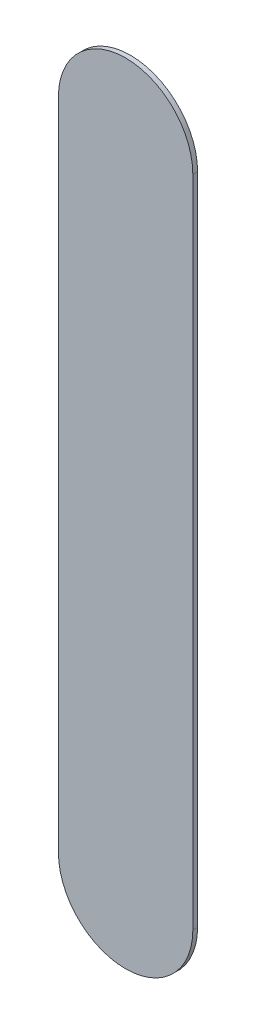
ISO-10303-21;
HEADER;
FILE_DESCRIPTION(('STEP AP214'),'2;1');
FILE_NAME('part.step','',(''),(''),'','','');
FILE_SCHEMA(('AUTOMOTIVE_DESIGN { 1 0 10303 214 1 1 1 1 }'));
ENDSEC;
DATA;
#1=APPLICATION_CONTEXT('core data for automotive mechanical design processes');
#2=APPLICATION_PROTOCOL_DEFINITION('international standard','automotive_design',2000,#1);
#3=PRODUCT_CONTEXT('',#1,'mechanical');
#4=PRODUCT('Part','Part','',(#3));
#5=PRODUCT_RELATED_PRODUCT_CATEGORY('part','',(#4));
#6=PRODUCT_DEFINITION_FORMATION('','',#4);
#7=PRODUCT_DEFINITION_CONTEXT('part definition',#1,'design');
#8=PRODUCT_DEFINITION('design','',#6,#7);
#9=PRODUCT_DEFINITION_SHAPE('','',#8);
#10=(LENGTH_UNIT() NAMED_UNIT(*) SI_UNIT(.MILLI.,.METRE.));
#11=(NAMED_UNIT(*) PLANE_ANGLE_UNIT() SI_UNIT($,.RADIAN.));
#12=(NAMED_UNIT(*) SI_UNIT($,.STERADIAN.) SOLID_ANGLE_UNIT());
#13=UNCERTAINTY_MEASURE_WITH_UNIT(LENGTH_MEASURE(1.E-05),#10,'distance_accuracy_value','');
#14=(GEOMETRIC_REPRESENTATION_CONTEXT(3) GLOBAL_UNCERTAINTY_ASSIGNED_CONTEXT((#13)) GLOBAL_UNIT_ASSIGNED_CONTEXT((#10,
#11,#12)) REPRESENTATION_CONTEXT('',''));
#15=CARTESIAN_POINT('',(0.,0.,0.));
#16=DIRECTION('',(0.,0.,1.));
#17=DIRECTION('',(1.,0.,0.));
#18=AXIS2_PLACEMENT_3D('',#15,#16,#17);
#19=CARTESIAN_POINT('',(76.979399,97.79,0.));
#20=DIRECTION('',(-1.,0.,0.));
#21=DIRECTION('',(0.,1.,0.));
#22=AXIS2_PLACEMENT_3D('',#19,#20,#21);
#23=PLANE('',#22);
#24=DIRECTION('',(0.,1.,0.));
#25=VECTOR('',#24,1.);
#26=CARTESIAN_POINT('',(76.979399,97.79,0.03556));
#27=LINE('',#26,#25);
#28=CARTESIAN_POINT('',(76.979399,97.79,0.03556));
#29=VERTEX_POINT('',#28);
#30=CARTESIAN_POINT('',(76.979399,102.6593832,0.03556));
#31=VERTEX_POINT('',#30);
#32=EDGE_CURVE('E11',#29,#31,#27,.T.);
#33=ORIENTED_EDGE('',*,*,#32,.F.);
#34=DIRECTION('',(0.,0.,1.));
#35=VECTOR('',#34,1.);
#36=CARTESIAN_POINT('',(76.979399,97.79,0.));
#37=LINE('',#36,#35);
#38=CARTESIAN_POINT('',(76.979399,97.79,0.));
#39=VERTEX_POINT('',#38);
#40=EDGE_CURVE('E24',#39,#29,#37,.T.);
#41=ORIENTED_EDGE('',*,*,#40,.F.);
#42=DIRECTION('',(0.,1.,0.));
#43=VECTOR('',#42,1.);
#44=CARTESIAN_POINT('',(76.979399,97.79,0.));
#45=LINE('',#44,#43);
#46=CARTESIAN_POINT('',(76.979399,102.6593832,0.));
#47=VERTEX_POINT('',#46);
#48=EDGE_CURVE('E75',#39,#47,#45,.T.);
#49=ORIENTED_EDGE('',*,*,#48,.T.);
#50=DIRECTION('',(0.,0.,1.));
#51=VECTOR('',#50,1.);
#52=CARTESIAN_POINT('',(76.979399,102.6593832,0.));
#53=LINE('',#52,#51);
#54=EDGE_CURVE('E37',#47,#31,#53,.T.);
#55=ORIENTED_EDGE('',*,*,#54,.T.);
#56=EDGE_LOOP('',(#33,#41,#49,#55));
#57=FACE_BOUND('',#56,.T.);
#58=ADVANCED_FACE('F17',(#57),#23,.F.);
#59=CARTESIAN_POINT('',(76.4794,102.6593832,0.));
#60=DIRECTION('',(0.,0.,-1.));
#61=DIRECTION('',(1.,0.,0.));
#62=AXIS2_PLACEMENT_3D('',#59,#60,#61);
#63=CYLINDRICAL_SURFACE('',#62,0.499999000000002);
#64=CARTESIAN_POINT('',(76.4794,102.6593832,0.03556));
#65=DIRECTION('',(0.,0.,1.));
#66=DIRECTION('',(1.,0.,0.));
#67=AXIS2_PLACEMENT_3D('',#64,#65,#66);
#68=CIRCLE('',#67,0.499999000000002);
#69=CARTESIAN_POINT('',(75.979401,102.6593832,0.03556));
#70=VERTEX_POINT('',#69);
#71=EDGE_CURVE('E83',#31,#70,#68,.T.);
#72=ORIENTED_EDGE('',*,*,#71,.F.);
#73=ORIENTED_EDGE('',*,*,#54,.F.);
#74=CARTESIAN_POINT('',(76.4794,102.6593832,0.));
#75=DIRECTION('',(0.,0.,1.));
#76=DIRECTION('',(1.,0.,0.));
#77=AXIS2_PLACEMENT_3D('',#74,#75,#76);
#78=CIRCLE('',#77,0.499999000000002);
#79=CARTESIAN_POINT('',(75.979401,102.6593832,0.));
#80=VERTEX_POINT('',#79);
#81=EDGE_CURVE('E81',#47,#80,#78,.T.);
#82=ORIENTED_EDGE('',*,*,#81,.T.);
#83=DIRECTION('',(0.,0.,1.));
#84=VECTOR('',#83,1.);
#85=CARTESIAN_POINT('',(75.979401,102.6593832,0.));
#86=LINE('',#85,#84);
#87=EDGE_CURVE('E67',#80,#70,#86,.T.);
#88=ORIENTED_EDGE('',*,*,#87,.T.);
#89=EDGE_LOOP('',(#72,#73,#82,#88));
#90=FACE_BOUND('',#89,.T.);
#91=ADVANCED_FACE('F89',(#90),#63,.T.);
#92=CARTESIAN_POINT('',(75.979401,102.6593832,0.));
#93=DIRECTION('',(1.,0.,0.));
#94=DIRECTION('',(0.,-1.,0.));
#95=AXIS2_PLACEMENT_3D('',#92,#93,#94);
#96=PLANE('',#95);
#97=DIRECTION('',(0.,-1.,0.));
#98=VECTOR('',#97,1.);
#99=CARTESIAN_POINT('',(75.979401,102.6593832,0.03556));
#100=LINE('',#99,#98);
#101=CARTESIAN_POINT('',(75.979401,97.79,0.03556));
#102=VERTEX_POINT('',#101);
#103=EDGE_CURVE('E71',#70,#102,#100,.T.);
#104=ORIENTED_EDGE('',*,*,#103,.F.);
#105=ORIENTED_EDGE('',*,*,#87,.F.);
#106=DIRECTION('',(0.,-1.,0.));
#107=VECTOR('',#106,1.);
#108=CARTESIAN_POINT('',(75.979401,102.6593832,0.));
#109=LINE('',#108,#107);
#110=CARTESIAN_POINT('',(75.979401,97.79,0.));
#111=VERTEX_POINT('',#110);
#112=EDGE_CURVE('E63',#80,#111,#109,.T.);
#113=ORIENTED_EDGE('',*,*,#112,.T.);
#114=DIRECTION('',(0.,0.,1.));
#115=VECTOR('',#114,1.);
#116=CARTESIAN_POINT('',(75.979401,97.79,0.));
#117=LINE('',#116,#115);
#118=EDGE_CURVE('E53',#111,#102,#117,.T.);
#119=ORIENTED_EDGE('',*,*,#118,.T.);
#120=EDGE_LOOP('',(#104,#105,#113,#119));
#121=FACE_BOUND('',#120,.T.);
#122=ADVANCED_FACE('F66',(#121),#96,.F.);
#123=CARTESIAN_POINT('',(76.4794,97.79,0.));
#124=DIRECTION('',(0.,0.,-1.));
#125=DIRECTION('',(-1.,0.,0.));
#126=AXIS2_PLACEMENT_3D('',#123,#124,#125);
#127=CYLINDRICAL_SURFACE('',#126,0.499999000000002);
#128=CARTESIAN_POINT('',(76.4794,97.79,0.03556));
#129=DIRECTION('',(0.,0.,1.));
#130=DIRECTION('',(-1.,0.,0.));
#131=AXIS2_PLACEMENT_3D('',#128,#129,#130);
#132=CIRCLE('',#131,0.499999000000002);
#133=EDGE_CURVE('E59',#102,#29,#132,.T.);
#134=ORIENTED_EDGE('',*,*,#133,.F.);
#135=ORIENTED_EDGE('',*,*,#118,.F.);
#136=CARTESIAN_POINT('',(76.4794,97.79,0.));
#137=DIRECTION('',(0.,0.,1.));
#138=DIRECTION('',(-1.,0.,0.));
#139=AXIS2_PLACEMENT_3D('',#136,#137,#138);
#140=CIRCLE('',#139,0.499999000000002);
#141=EDGE_CURVE('E57',#111,#39,#140,.T.);
#142=ORIENTED_EDGE('',*,*,#141,.T.);
#143=ORIENTED_EDGE('',*,*,#40,.T.);
#144=EDGE_LOOP('',(#134,#135,#142,#143));
#145=FACE_BOUND('',#144,.T.);
#146=ADVANCED_FACE('F55',(#145),#127,.T.);
#147=CARTESIAN_POINT('',(76.979399,97.79,0.));
#148=DIRECTION('',(0.,0.,-1.));
#149=DIRECTION('',(-1.,0.,0.));
#150=AXIS2_PLACEMENT_3D('',#147,#148,#149);
#151=PLANE('',#150);
#152=ORIENTED_EDGE('',*,*,#141,.F.);
#153=ORIENTED_EDGE('',*,*,#112,.F.);
#154=ORIENTED_EDGE('',*,*,#81,.F.);
#155=ORIENTED_EDGE('',*,*,#48,.F.);
#156=EDGE_LOOP('',(#152,#153,#154,#155));
#157=FACE_BOUND('',#156,.T.);
#158=ADVANCED_FACE('F74',(#157),#151,.T.);
#159=CARTESIAN_POINT('',(76.979399,97.79,0.03556));
#160=DIRECTION('',(0.,0.,-1.));
#161=DIRECTION('',(-1.,0.,0.));
#162=AXIS2_PLACEMENT_3D('',#159,#160,#161);
#163=PLANE('',#162);
#164=ORIENTED_EDGE('',*,*,#32,.T.);
#165=ORIENTED_EDGE('',*,*,#71,.T.);
#166=ORIENTED_EDGE('',*,*,#103,.T.);
#167=ORIENTED_EDGE('',*,*,#133,.T.);
#168=EDGE_LOOP('',(#164,#165,#166,#167));
#169=FACE_BOUND('',#168,.T.);
#170=ADVANCED_FACE('F91',(#169),#163,.F.);
#171=CLOSED_SHELL('',(#58,#91,#122,#146,#158,#170));
#172=MANIFOLD_SOLID_BREP('B1',#171);
#173=ADVANCED_BREP_SHAPE_REPRESENTATION('',(#18,#172),#14);
#174=SHAPE_DEFINITION_REPRESENTATION(#9,#173);
ENDSEC;
END-ISO-10303-21;
